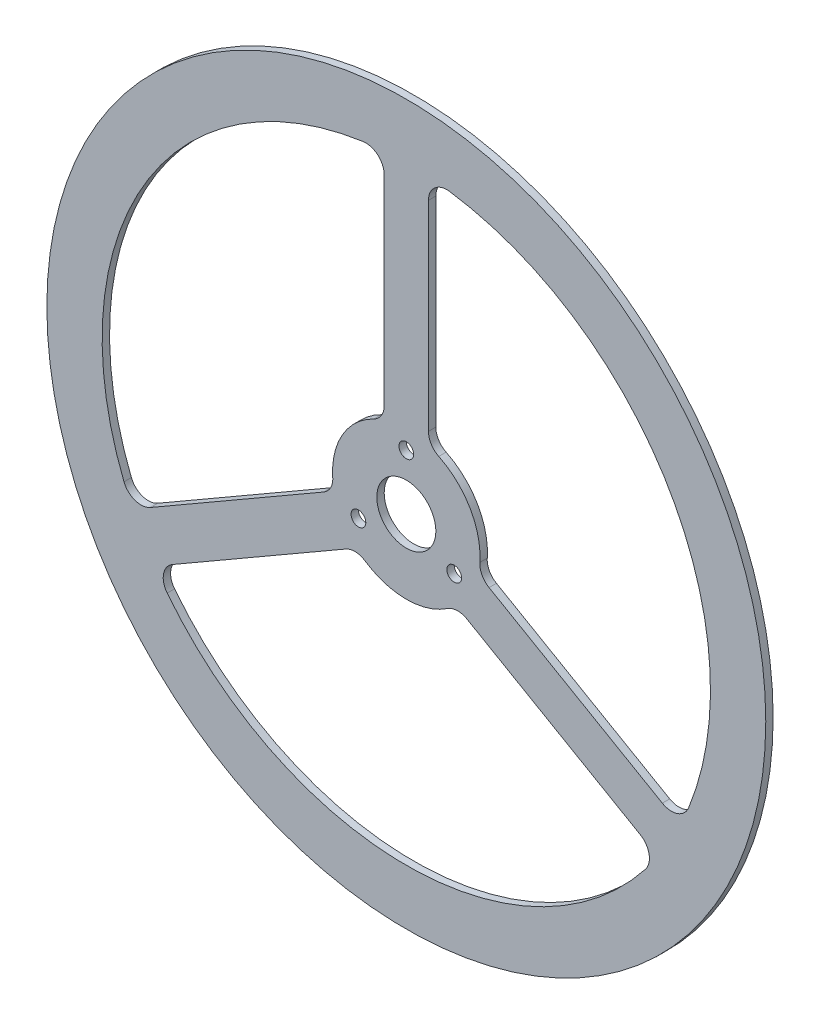
ISO-10303-21;
HEADER;
FILE_DESCRIPTION(('STEP AP214'),'2;1');
FILE_NAME('part.step','',(''),(''),'','','');
FILE_SCHEMA(('AUTOMOTIVE_DESIGN { 1 0 10303 214 1 1 1 1 }'));
ENDSEC;
DATA;
#1=APPLICATION_CONTEXT('core data for automotive mechanical design processes');
#2=APPLICATION_PROTOCOL_DEFINITION('international standard','automotive_design',2000,#1);
#3=PRODUCT_CONTEXT('',#1,'mechanical');
#4=PRODUCT('Part','Part','',(#3));
#5=PRODUCT_RELATED_PRODUCT_CATEGORY('part','',(#4));
#6=PRODUCT_DEFINITION_FORMATION('','',#4);
#7=PRODUCT_DEFINITION_CONTEXT('part definition',#1,'design');
#8=PRODUCT_DEFINITION('design','',#6,#7);
#9=PRODUCT_DEFINITION_SHAPE('','',#8);
#10=(LENGTH_UNIT() NAMED_UNIT(*) SI_UNIT(.MILLI.,.METRE.));
#11=(NAMED_UNIT(*) PLANE_ANGLE_UNIT() SI_UNIT($,.RADIAN.));
#12=(NAMED_UNIT(*) SI_UNIT($,.STERADIAN.) SOLID_ANGLE_UNIT());
#13=UNCERTAINTY_MEASURE_WITH_UNIT(LENGTH_MEASURE(1.E-05),#10,'distance_accuracy_value','');
#14=(GEOMETRIC_REPRESENTATION_CONTEXT(3) GLOBAL_UNCERTAINTY_ASSIGNED_CONTEXT((#13)) GLOBAL_UNIT_ASSIGNED_CONTEXT((#10,
#11,#12)) REPRESENTATION_CONTEXT('',''));
#15=CARTESIAN_POINT('',(0.,0.,0.));
#16=DIRECTION('',(0.,0.,1.));
#17=DIRECTION('',(1.,0.,0.));
#18=AXIS2_PLACEMENT_3D('',#15,#16,#17);
#19=CARTESIAN_POINT('',(0.,0.,0.));
#20=DIRECTION('',(0.,0.,1.));
#21=DIRECTION('',(1.,0.,0.));
#22=AXIS2_PLACEMENT_3D('',#19,#20,#21);
#23=PLANE('',#22);
#24=CARTESIAN_POINT('',(0.,0.,0.));
#25=DIRECTION('',(0.,0.,-1.));
#26=DIRECTION('',(-1.,0.,0.));
#27=AXIS2_PLACEMENT_3D('',#24,#25,#26);
#28=CIRCLE('',#27,97.5);
#29=CARTESIAN_POINT('',(-97.5,0.,0.));
#30=VERTEX_POINT('',#29);
#31=EDGE_CURVE('E286',#30,#30,#28,.F.);
#32=ORIENTED_EDGE('',*,*,#31,.F.);
#33=EDGE_LOOP('',(#32));
#34=FACE_BOUND('',#33,.T.);
#35=CARTESIAN_POINT('',(11.,22.4499443206437,0.));
#36=DIRECTION('',(0.,0.,-1.));
#37=DIRECTION('',(-1.,0.,0.));
#38=AXIS2_PLACEMENT_3D('',#35,#36,#37);
#39=CIRCLE('',#38,5.);
#40=CARTESIAN_POINT('',(5.99999999999999,22.4499443206437,0.));
#41=VERTEX_POINT('',#40);
#42=CARTESIAN_POINT('',(8.79999999999999,17.9599554565149,0.));
#43=VERTEX_POINT('',#42);
#44=EDGE_CURVE('E312',#41,#43,#39,.F.);
#45=ORIENTED_EDGE('',*,*,#44,.T.);
#46=CARTESIAN_POINT('',(0.,0.,0.));
#47=DIRECTION('',(0.,0.,-1.));
#48=DIRECTION('',(-1.,0.,0.));
#49=AXIS2_PLACEMENT_3D('',#46,#47,#48);
#50=CIRCLE('',#49,20.);
#51=CARTESIAN_POINT('',(19.9537776761789,-1.35895417495439,0.));
#52=VERTEX_POINT('',#51);
#53=EDGE_CURVE('E291',#52,#43,#50,.F.);
#54=ORIENTED_EDGE('',*,*,#53,.F.);
#55=CARTESIAN_POINT('',(24.9422220952236,-1.69869271869299,0.));
#56=DIRECTION('',(0.,0.,-1.));
#57=DIRECTION('',(-1.,0.,0.));
#58=AXIS2_PLACEMENT_3D('',#55,#56,#57);
#59=CIRCLE('',#58,5.);
#60=CARTESIAN_POINT('',(22.4422220952236,-6.02881973761519,0.));
#61=VERTEX_POINT('',#60);
#62=EDGE_CURVE('E296',#52,#61,#59,.F.);
#63=ORIENTED_EDGE('',*,*,#62,.T.);
#64=DIRECTION('',(0.866025403784439,-0.5,0.));
#65=VECTOR('',#64,1.);
#66=CARTESIAN_POINT('',(22.4422220952236,-6.02881973761519,0.));
#67=LINE('',#66,#65);
#68=CARTESIAN_POINT('',(69.4374706020631,-33.1615391136723,0.));
#69=VERTEX_POINT('',#68);
#70=EDGE_CURVE('E190',#61,#69,#67,.T.);
#71=ORIENTED_EDGE('',*,*,#70,.T.);
#72=CARTESIAN_POINT('',(71.9374706020631,-28.8314120947501,0.));
#73=DIRECTION('',(0.,0.,-1.));
#74=DIRECTION('',(-1.,0.,0.));
#75=AXIS2_PLACEMENT_3D('',#72,#73,#74);
#76=CIRCLE('',#75,5.00000000000002);
#77=CARTESIAN_POINT('',(76.5785977376801,-30.6915031976373,0.));
#78=VERTEX_POINT('',#77);
#79=EDGE_CURVE('E185',#69,#78,#76,.F.);
#80=ORIENTED_EDGE('',*,*,#79,.T.);
#81=CARTESIAN_POINT('',(0.,0.,0.));
#82=DIRECTION('',(0.,0.,-1.));
#83=DIRECTION('',(-1.,0.,0.));
#84=AXIS2_PLACEMENT_3D('',#81,#82,#83);
#85=CIRCLE('',#84,82.5);
#86=CARTESIAN_POINT('',(11.7096774193548,81.6647626258391,0.));
#87=VERTEX_POINT('',#86);
#88=EDGE_CURVE('E302',#78,#87,#85,.F.);
#89=ORIENTED_EDGE('',*,*,#88,.T.);
#90=CARTESIAN_POINT('',(11.,76.715383072758,0.));
#91=DIRECTION('',(0.,0.,-1.));
#92=DIRECTION('',(-1.,0.,0.));
#93=AXIS2_PLACEMENT_3D('',#90,#91,#92);
#94=CIRCLE('',#93,5.);
#95=CARTESIAN_POINT('',(5.99999999999999,76.715383072758,0.));
#96=VERTEX_POINT('',#95);
#97=EDGE_CURVE('E307',#87,#96,#94,.F.);
#98=ORIENTED_EDGE('',*,*,#97,.T.);
#99=DIRECTION('',(0.,1.,0.));
#100=VECTOR('',#99,1.);
#101=CARTESIAN_POINT('',(5.99999999999999,22.4499443206437,0.));
#102=LINE('',#101,#100);
#103=EDGE_CURVE('E781',#96,#41,#102,.F.);
#104=ORIENTED_EDGE('',*,*,#103,.T.);
#105=EDGE_LOOP('',(#45,#54,#63,#71,#80,#89,#98,#104));
#106=FACE_BOUND('',#105,.T.);
#107=CARTESIAN_POINT('',(13.9422220952236,-20.7512516019506,0.));
#108=DIRECTION('',(0.,0.,-1.));
#109=DIRECTION('',(-1.,0.,0.));
#110=AXIS2_PLACEMENT_3D('',#107,#108,#109);
#111=CIRCLE('',#110,5.);
#112=CARTESIAN_POINT('',(16.4422220952236,-16.4211245830284,0.));
#113=VERTEX_POINT('',#112);
#114=CARTESIAN_POINT('',(11.1537776761789,-16.6010012815605,0.));
#115=VERTEX_POINT('',#114);
#116=EDGE_CURVE('E342',#113,#115,#111,.F.);
#117=ORIENTED_EDGE('',*,*,#116,.T.);
#118=CARTESIAN_POINT('',(0.,0.,0.));
#119=DIRECTION('',(0.,0.,-1.));
#120=DIRECTION('',(-1.,0.,0.));
#121=AXIS2_PLACEMENT_3D('',#118,#119,#120);
#122=CIRCLE('',#121,20.);
#123=CARTESIAN_POINT('',(-11.1537776761789,-16.6010012815605,0.));
#124=VERTEX_POINT('',#123);
#125=EDGE_CURVE('E317',#124,#115,#122,.F.);
#126=ORIENTED_EDGE('',*,*,#125,.F.);
#127=CARTESIAN_POINT('',(-13.9422220952236,-20.7512516019506,0.));
#128=DIRECTION('',(0.,0.,-1.));
#129=DIRECTION('',(-1.,0.,0.));
#130=AXIS2_PLACEMENT_3D('',#127,#128,#129);
#131=CIRCLE('',#130,5.);
#132=CARTESIAN_POINT('',(-16.4422220952236,-16.4211245830285,0.));
#133=VERTEX_POINT('',#132);
#134=EDGE_CURVE('E322',#124,#133,#131,.F.);
#135=ORIENTED_EDGE('',*,*,#134,.T.);
#136=DIRECTION('',(-0.866025403784439,-0.5,0.));
#137=VECTOR('',#136,1.);
#138=CARTESIAN_POINT('',(-16.4422220952236,-16.4211245830285,0.));
#139=LINE('',#138,#137);
#140=CARTESIAN_POINT('',(-63.4374706020631,-43.5538439590856,0.));
#141=VERTEX_POINT('',#140);
#142=EDGE_CURVE('E783',#133,#141,#139,.T.);
#143=ORIENTED_EDGE('',*,*,#142,.T.);
#144=CARTESIAN_POINT('',(-60.9374706020631,-47.8839709780078,0.));
#145=DIRECTION('',(0.,0.,-1.));
#146=DIRECTION('',(-1.,0.,0.));
#147=AXIS2_PLACEMENT_3D('',#144,#145,#146);
#148=CIRCLE('',#147,5.);
#149=CARTESIAN_POINT('',(-64.8689203183253,-50.9732594282018,0.));
#150=VERTEX_POINT('',#149);
#151=EDGE_CURVE('E327',#141,#150,#148,.F.);
#152=ORIENTED_EDGE('',*,*,#151,.T.);
#153=CARTESIAN_POINT('',(0.,0.,0.));
#154=DIRECTION('',(0.,0.,-1.));
#155=DIRECTION('',(-1.,0.,0.));
#156=AXIS2_PLACEMENT_3D('',#153,#154,#155);
#157=CIRCLE('',#156,82.5);
#158=CARTESIAN_POINT('',(64.8689203183253,-50.9732594282018,0.));
#159=VERTEX_POINT('',#158);
#160=EDGE_CURVE('E332',#150,#159,#157,.F.);
#161=ORIENTED_EDGE('',*,*,#160,.T.);
#162=CARTESIAN_POINT('',(60.9374706020631,-47.8839709780078,0.));
#163=DIRECTION('',(0.,0.,-1.));
#164=DIRECTION('',(-1.,0.,0.));
#165=AXIS2_PLACEMENT_3D('',#162,#163,#164);
#166=CIRCLE('',#165,5.);
#167=CARTESIAN_POINT('',(63.4374706020631,-43.5538439590856,0.));
#168=VERTEX_POINT('',#167);
#169=EDGE_CURVE('E337',#159,#168,#166,.F.);
#170=ORIENTED_EDGE('',*,*,#169,.T.);
#171=DIRECTION('',(-0.866025403784439,0.5,0.));
#172=VECTOR('',#171,1.);
#173=CARTESIAN_POINT('',(16.4422220952236,-16.4211245830284,0.));
#174=LINE('',#173,#172);
#175=EDGE_CURVE('E787',#168,#113,#174,.T.);
#176=ORIENTED_EDGE('',*,*,#175,.T.);
#177=EDGE_LOOP('',(#117,#126,#135,#143,#152,#161,#170,#176));
#178=FACE_BOUND('',#177,.T.);
#179=CARTESIAN_POINT('',(0.,0.,0.));
#180=DIRECTION('',(0.,0.,-1.));
#181=DIRECTION('',(-1.,0.,0.));
#182=AXIS2_PLACEMENT_3D('',#179,#180,#181);
#183=CIRCLE('',#182,8.);
#184=CARTESIAN_POINT('',(-8.,0.,0.));
#185=VERTEX_POINT('',#184);
#186=EDGE_CURVE('E346',#185,#185,#183,.F.);
#187=ORIENTED_EDGE('',*,*,#186,.T.);
#188=EDGE_LOOP('',(#187));
#189=FACE_BOUND('',#188,.T.);
#190=CARTESIAN_POINT('',(-24.9422220952236,-1.698692718693,0.));
#191=DIRECTION('',(0.,0.,-1.));
#192=DIRECTION('',(-1.,0.,0.));
#193=AXIS2_PLACEMENT_3D('',#190,#191,#192);
#194=CIRCLE('',#193,5.);
#195=CARTESIAN_POINT('',(-22.4422220952236,-6.02881973761519,0.));
#196=VERTEX_POINT('',#195);
#197=CARTESIAN_POINT('',(-19.9537776761789,-1.3589541749544,0.));
#198=VERTEX_POINT('',#197);
#199=EDGE_CURVE('E374',#196,#198,#194,.F.);
#200=ORIENTED_EDGE('',*,*,#199,.T.);
#201=CARTESIAN_POINT('',(0.,0.,0.));
#202=DIRECTION('',(0.,0.,-1.));
#203=DIRECTION('',(-1.,0.,0.));
#204=AXIS2_PLACEMENT_3D('',#201,#202,#203);
#205=CIRCLE('',#204,20.);
#206=CARTESIAN_POINT('',(-8.8,17.9599554565149,0.));
#207=VERTEX_POINT('',#206);
#208=EDGE_CURVE('E350',#207,#198,#205,.F.);
#209=ORIENTED_EDGE('',*,*,#208,.F.);
#210=CARTESIAN_POINT('',(-11.,22.4499443206436,0.));
#211=DIRECTION('',(0.,0.,-1.));
#212=DIRECTION('',(-1.,0.,0.));
#213=AXIS2_PLACEMENT_3D('',#210,#211,#212);
#214=CIRCLE('',#213,5.);
#215=CARTESIAN_POINT('',(-5.99999999999999,22.4499443206436,0.));
#216=VERTEX_POINT('',#215);
#217=EDGE_CURVE('E354',#207,#216,#214,.F.);
#218=ORIENTED_EDGE('',*,*,#217,.T.);
#219=DIRECTION('',(0.,1.,0.));
#220=VECTOR('',#219,1.);
#221=CARTESIAN_POINT('',(-5.99999999999999,22.4499443206436,0.));
#222=LINE('',#221,#220);
#223=CARTESIAN_POINT('',(-6.,76.715383072758,0.));
#224=VERTEX_POINT('',#223);
#225=EDGE_CURVE('E790',#216,#224,#222,.T.);
#226=ORIENTED_EDGE('',*,*,#225,.T.);
#227=CARTESIAN_POINT('',(-11.,76.715383072758,0.));
#228=DIRECTION('',(0.,0.,-1.));
#229=DIRECTION('',(-1.,0.,0.));
#230=AXIS2_PLACEMENT_3D('',#227,#228,#229);
#231=CIRCLE('',#230,5.);
#232=CARTESIAN_POINT('',(-11.7096774193548,81.6647626258391,0.));
#233=VERTEX_POINT('',#232);
#234=EDGE_CURVE('E359',#224,#233,#231,.F.);
#235=ORIENTED_EDGE('',*,*,#234,.T.);
#236=CARTESIAN_POINT('',(0.,0.,0.));
#237=DIRECTION('',(0.,0.,-1.));
#238=DIRECTION('',(-1.,0.,0.));
#239=AXIS2_PLACEMENT_3D('',#236,#237,#238);
#240=CIRCLE('',#239,82.5);
#241=CARTESIAN_POINT('',(-76.5785977376801,-30.6915031976373,0.));
#242=VERTEX_POINT('',#241);
#243=EDGE_CURVE('E365',#233,#242,#240,.F.);
#244=ORIENTED_EDGE('',*,*,#243,.T.);
#245=CARTESIAN_POINT('',(-71.9374706020631,-28.8314120947501,0.));
#246=DIRECTION('',(0.,0.,-1.));
#247=DIRECTION('',(-1.,0.,0.));
#248=AXIS2_PLACEMENT_3D('',#245,#246,#247);
#249=CIRCLE('',#248,5.);
#250=CARTESIAN_POINT('',(-69.4374706020631,-33.1615391136723,0.));
#251=VERTEX_POINT('',#250);
#252=EDGE_CURVE('E369',#242,#251,#249,.F.);
#253=ORIENTED_EDGE('',*,*,#252,.T.);
#254=DIRECTION('',(0.866025403784439,0.5,0.));
#255=VECTOR('',#254,1.);
#256=CARTESIAN_POINT('',(-22.4422220952236,-6.02881973761519,0.));
#257=LINE('',#256,#255);
#258=EDGE_CURVE('E769',#251,#196,#257,.T.);
#259=ORIENTED_EDGE('',*,*,#258,.T.);
#260=EDGE_LOOP('',(#200,#209,#218,#226,#235,#244,#253,#259));
#261=FACE_BOUND('',#260,.T.);
#262=CARTESIAN_POINT('',(0.,15.,0.));
#263=DIRECTION('',(0.,0.,-1.));
#264=DIRECTION('',(-1.,0.,0.));
#265=AXIS2_PLACEMENT_3D('',#262,#263,#264);
#266=CIRCLE('',#265,2.);
#267=CARTESIAN_POINT('',(-2.,15.,0.));
#268=VERTEX_POINT('',#267);
#269=EDGE_CURVE('E379',#268,#268,#266,.F.);
#270=ORIENTED_EDGE('',*,*,#269,.T.);
#271=EDGE_LOOP('',(#270));
#272=FACE_BOUND('',#271,.T.);
#273=CARTESIAN_POINT('',(12.9903810567665,-7.50000000000006,0.));
#274=DIRECTION('',(0.,0.,-1.));
#275=DIRECTION('',(-1.,0.,0.));
#276=AXIS2_PLACEMENT_3D('',#273,#274,#275);
#277=CIRCLE('',#276,2.);
#278=CARTESIAN_POINT('',(10.9903810567665,-7.50000000000006,0.));
#279=VERTEX_POINT('',#278);
#280=EDGE_CURVE('E382',#279,#279,#277,.F.);
#281=ORIENTED_EDGE('',*,*,#280,.T.);
#282=EDGE_LOOP('',(#281));
#283=FACE_BOUND('',#282,.T.);
#284=CARTESIAN_POINT('',(-12.9903810567666,-7.49999999999988,0.));
#285=DIRECTION('',(0.,0.,-1.));
#286=DIRECTION('',(-1.,0.,0.));
#287=AXIS2_PLACEMENT_3D('',#284,#285,#286);
#288=CIRCLE('',#287,2.);
#289=CARTESIAN_POINT('',(-14.9903810567667,-7.49999999999988,0.));
#290=VERTEX_POINT('',#289);
#291=EDGE_CURVE('E20',#290,#290,#288,.F.);
#292=ORIENTED_EDGE('',*,*,#291,.T.);
#293=EDGE_LOOP('',(#292));
#294=FACE_BOUND('',#293,.T.);
#295=ADVANCED_FACE('F17',(#34,#106,#178,#189,#261,#272,#283,#294),#23,.F.);
#296=CARTESIAN_POINT('',(-12.9903810567666,-7.49999999999988,2.));
#297=DIRECTION('',(0.,0.,-1.));
#298=DIRECTION('',(-1.,0.,0.));
#299=AXIS2_PLACEMENT_3D('',#296,#297,#298);
#300=CYLINDRICAL_SURFACE('',#299,2.);
#301=ORIENTED_EDGE('',*,*,#291,.F.);
#302=EDGE_LOOP('',(#301));
#303=FACE_BOUND('',#302,.T.);
#304=CARTESIAN_POINT('',(-12.9903810567666,-7.49999999999988,2.));
#305=DIRECTION('',(0.,0.,-1.));
#306=DIRECTION('',(-1.,0.,0.));
#307=AXIS2_PLACEMENT_3D('',#304,#305,#306);
#308=CIRCLE('',#307,2.);
#309=CARTESIAN_POINT('',(-14.9903810567667,-7.49999999999988,2.));
#310=VERTEX_POINT('',#309);
#311=EDGE_CURVE('E282',#310,#310,#308,.T.);
#312=ORIENTED_EDGE('',*,*,#311,.F.);
#313=EDGE_LOOP('',(#312));
#314=FACE_BOUND('',#313,.T.);
#315=ADVANCED_FACE('F395',(#303,#314),#300,.F.);
#316=CARTESIAN_POINT('',(12.9903810567665,-7.50000000000006,2.));
#317=DIRECTION('',(0.,0.,-1.));
#318=DIRECTION('',(-1.,0.,0.));
#319=AXIS2_PLACEMENT_3D('',#316,#317,#318);
#320=CYLINDRICAL_SURFACE('',#319,2.);
#321=ORIENTED_EDGE('',*,*,#280,.F.);
#322=EDGE_LOOP('',(#321));
#323=FACE_BOUND('',#322,.T.);
#324=CARTESIAN_POINT('',(12.9903810567665,-7.50000000000006,2.));
#325=DIRECTION('',(0.,0.,-1.));
#326=DIRECTION('',(-1.,0.,0.));
#327=AXIS2_PLACEMENT_3D('',#324,#325,#326);
#328=CIRCLE('',#327,2.);
#329=CARTESIAN_POINT('',(10.9903810567665,-7.50000000000006,2.));
#330=VERTEX_POINT('',#329);
#331=EDGE_CURVE('E278',#330,#330,#328,.T.);
#332=ORIENTED_EDGE('',*,*,#331,.F.);
#333=EDGE_LOOP('',(#332));
#334=FACE_BOUND('',#333,.T.);
#335=ADVANCED_FACE('F398',(#323,#334),#320,.F.);
#336=CARTESIAN_POINT('',(0.,15.,2.));
#337=DIRECTION('',(0.,0.,-1.));
#338=DIRECTION('',(-1.,0.,0.));
#339=AXIS2_PLACEMENT_3D('',#336,#337,#338);
#340=CYLINDRICAL_SURFACE('',#339,2.);
#341=ORIENTED_EDGE('',*,*,#269,.F.);
#342=EDGE_LOOP('',(#341));
#343=FACE_BOUND('',#342,.T.);
#344=CARTESIAN_POINT('',(0.,15.,2.));
#345=DIRECTION('',(0.,0.,-1.));
#346=DIRECTION('',(-1.,0.,0.));
#347=AXIS2_PLACEMENT_3D('',#344,#345,#346);
#348=CIRCLE('',#347,2.);
#349=CARTESIAN_POINT('',(-2.,15.,2.));
#350=VERTEX_POINT('',#349);
#351=EDGE_CURVE('E274',#350,#350,#348,.T.);
#352=ORIENTED_EDGE('',*,*,#351,.F.);
#353=EDGE_LOOP('',(#352));
#354=FACE_BOUND('',#353,.T.);
#355=ADVANCED_FACE('F507',(#343,#354),#340,.F.);
#356=CARTESIAN_POINT('',(-24.9422220952236,-1.698692718693,2.));
#357=DIRECTION('',(0.,0.,-1.));
#358=DIRECTION('',(-1.,0.,0.));
#359=AXIS2_PLACEMENT_3D('',#356,#357,#358);
#360=CYLINDRICAL_SURFACE('',#359,5.);
#361=DIRECTION('',(0.,0.,1.));
#362=VECTOR('',#361,1.);
#363=CARTESIAN_POINT('',(-22.4422220952236,-6.02881973761519,2.));
#364=LINE('',#363,#362);
#365=CARTESIAN_POINT('',(-22.4422220952236,-6.02881973761519,2.));
#366=VERTEX_POINT('',#365);
#367=EDGE_CURVE('E377',#196,#366,#364,.T.);
#368=ORIENTED_EDGE('',*,*,#367,.T.);
#369=CARTESIAN_POINT('',(-24.9422220952236,-1.698692718693,2.));
#370=DIRECTION('',(0.,0.,-1.));
#371=DIRECTION('',(-1.,0.,0.));
#372=AXIS2_PLACEMENT_3D('',#369,#370,#371);
#373=CIRCLE('',#372,5.);
#374=CARTESIAN_POINT('',(-19.9537776761789,-1.3589541749544,2.));
#375=VERTEX_POINT('',#374);
#376=EDGE_CURVE('E270',#375,#366,#373,.T.);
#377=ORIENTED_EDGE('',*,*,#376,.F.);
#378=DIRECTION('',(0.,0.,-1.));
#379=VECTOR('',#378,1.);
#380=CARTESIAN_POINT('',(-19.9537776761789,-1.3589541749544,2.));
#381=LINE('',#380,#379);
#382=EDGE_CURVE('E378',#198,#375,#381,.F.);
#383=ORIENTED_EDGE('',*,*,#382,.F.);
#384=ORIENTED_EDGE('',*,*,#199,.F.);
#385=EDGE_LOOP('',(#368,#377,#383,#384));
#386=FACE_BOUND('',#385,.T.);
#387=ADVANCED_FACE('F503',(#386),#360,.F.);
#388=CARTESIAN_POINT('',(-22.4422220952236,-6.02881973761519,2.));
#389=DIRECTION('',(0.5,-0.866025403784439,0.));
#390=DIRECTION('',(0.866025403784439,0.5,0.));
#391=AXIS2_PLACEMENT_3D('',#388,#389,#390);
#392=PLANE('',#391);
#393=DIRECTION('',(0.,0.,-1.));
#394=VECTOR('',#393,1.);
#395=CARTESIAN_POINT('',(-69.4374706020631,-33.1615391136724,2.));
#396=LINE('',#395,#394);
#397=CARTESIAN_POINT('',(-69.4374706020631,-33.1615391136724,2.));
#398=VERTEX_POINT('',#397);
#399=EDGE_CURVE('E373',#251,#398,#396,.F.);
#400=ORIENTED_EDGE('',*,*,#399,.T.);
#401=DIRECTION('',(-0.866025403784439,-0.5,0.));
#402=VECTOR('',#401,1.);
#403=CARTESIAN_POINT('',(-22.4422220952236,-6.02881973761519,2.));
#404=LINE('',#403,#402);
#405=EDGE_CURVE('E269',#366,#398,#404,.T.);
#406=ORIENTED_EDGE('',*,*,#405,.F.);
#407=ORIENTED_EDGE('',*,*,#367,.F.);
#408=ORIENTED_EDGE('',*,*,#258,.F.);
#409=EDGE_LOOP('',(#400,#406,#407,#408));
#410=FACE_BOUND('',#409,.T.);
#411=ADVANCED_FACE('F499',(#410),#392,.F.);
#412=CARTESIAN_POINT('',(-71.9374706020631,-28.8314120947501,2.));
#413=DIRECTION('',(0.,0.,-1.));
#414=DIRECTION('',(-1.,0.,0.));
#415=AXIS2_PLACEMENT_3D('',#412,#413,#414);
#416=CYLINDRICAL_SURFACE('',#415,5.);
#417=DIRECTION('',(0.,0.,-1.));
#418=VECTOR('',#417,1.);
#419=CARTESIAN_POINT('',(-76.5785977376801,-30.6915031976373,2.));
#420=LINE('',#419,#418);
#421=CARTESIAN_POINT('',(-76.5785977376801,-30.6915031976373,2.));
#422=VERTEX_POINT('',#421);
#423=EDGE_CURVE('E368',#242,#422,#420,.F.);
#424=ORIENTED_EDGE('',*,*,#423,.T.);
#425=CARTESIAN_POINT('',(-71.9374706020631,-28.8314120947501,2.));
#426=DIRECTION('',(0.,0.,-1.));
#427=DIRECTION('',(-1.,0.,0.));
#428=AXIS2_PLACEMENT_3D('',#425,#426,#427);
#429=CIRCLE('',#428,5.);
#430=EDGE_CURVE('E265',#398,#422,#429,.T.);
#431=ORIENTED_EDGE('',*,*,#430,.F.);
#432=ORIENTED_EDGE('',*,*,#399,.F.);
#433=ORIENTED_EDGE('',*,*,#252,.F.);
#434=EDGE_LOOP('',(#424,#431,#432,#433));
#435=FACE_BOUND('',#434,.T.);
#436=ADVANCED_FACE('F495',(#435),#416,.F.);
#437=CARTESIAN_POINT('',(0.,0.,2.));
#438=DIRECTION('',(0.,0.,-1.));
#439=DIRECTION('',(-1.,0.,0.));
#440=AXIS2_PLACEMENT_3D('',#437,#438,#439);
#441=CYLINDRICAL_SURFACE('',#440,82.5);
#442=DIRECTION('',(0.,0.,-1.));
#443=VECTOR('',#442,1.);
#444=CARTESIAN_POINT('',(-11.7096774193548,81.6647626258391,2.));
#445=LINE('',#444,#443);
#446=CARTESIAN_POINT('',(-11.7096774193548,81.6647626258391,2.));
#447=VERTEX_POINT('',#446);
#448=EDGE_CURVE('E364',#233,#447,#445,.F.);
#449=ORIENTED_EDGE('',*,*,#448,.T.);
#450=CARTESIAN_POINT('',(0.,0.,2.));
#451=DIRECTION('',(0.,0.,-1.));
#452=DIRECTION('',(-1.,0.,0.));
#453=AXIS2_PLACEMENT_3D('',#450,#451,#452);
#454=CIRCLE('',#453,82.5);
#455=EDGE_CURVE('E262',#422,#447,#454,.T.);
#456=ORIENTED_EDGE('',*,*,#455,.F.);
#457=ORIENTED_EDGE('',*,*,#423,.F.);
#458=ORIENTED_EDGE('',*,*,#243,.F.);
#459=EDGE_LOOP('',(#449,#456,#457,#458));
#460=FACE_BOUND('',#459,.T.);
#461=ADVANCED_FACE('F491',(#460),#441,.F.);
#462=CARTESIAN_POINT('',(-11.,76.715383072758,2.));
#463=DIRECTION('',(0.,0.,-1.));
#464=DIRECTION('',(-1.,0.,0.));
#465=AXIS2_PLACEMENT_3D('',#462,#463,#464);
#466=CYLINDRICAL_SURFACE('',#465,5.);
#467=DIRECTION('',(0.,0.,1.));
#468=VECTOR('',#467,1.);
#469=CARTESIAN_POINT('',(-6.,76.715383072758,2.));
#470=LINE('',#469,#468);
#471=CARTESIAN_POINT('',(-6.,76.715383072758,2.));
#472=VERTEX_POINT('',#471);
#473=EDGE_CURVE('E363',#224,#472,#470,.T.);
#474=ORIENTED_EDGE('',*,*,#473,.T.);
#475=CARTESIAN_POINT('',(-11.,76.715383072758,2.));
#476=DIRECTION('',(0.,0.,-1.));
#477=DIRECTION('',(-1.,0.,0.));
#478=AXIS2_PLACEMENT_3D('',#475,#476,#477);
#479=CIRCLE('',#478,5.);
#480=EDGE_CURVE('E259',#447,#472,#479,.T.);
#481=ORIENTED_EDGE('',*,*,#480,.F.);
#482=ORIENTED_EDGE('',*,*,#448,.F.);
#483=ORIENTED_EDGE('',*,*,#234,.F.);
#484=EDGE_LOOP('',(#474,#481,#482,#483));
#485=FACE_BOUND('',#484,.T.);
#486=ADVANCED_FACE('F487',(#485),#466,.F.);
#487=CARTESIAN_POINT('',(-5.99999999999999,22.4499443206436,2.));
#488=DIRECTION('',(1.,0.,0.));
#489=DIRECTION('',(0.,1.,0.));
#490=AXIS2_PLACEMENT_3D('',#487,#488,#489);
#491=PLANE('',#490);
#492=DIRECTION('',(0.,0.,-1.));
#493=VECTOR('',#492,1.);
#494=CARTESIAN_POINT('',(-5.99999999999999,22.4499443206436,2.));
#495=LINE('',#494,#493);
#496=CARTESIAN_POINT('',(-6.,22.4499443206436,2.));
#497=VERTEX_POINT('',#496);
#498=EDGE_CURVE('E358',#216,#497,#495,.F.);
#499=ORIENTED_EDGE('',*,*,#498,.T.);
#500=DIRECTION('',(0.,1.,0.));
#501=VECTOR('',#500,1.);
#502=CARTESIAN_POINT('',(-6.,0.,2.));
#503=LINE('',#502,#501);
#504=EDGE_CURVE('E258',#472,#497,#503,.F.);
#505=ORIENTED_EDGE('',*,*,#504,.F.);
#506=ORIENTED_EDGE('',*,*,#473,.F.);
#507=ORIENTED_EDGE('',*,*,#225,.F.);
#508=EDGE_LOOP('',(#499,#505,#506,#507));
#509=FACE_BOUND('',#508,.T.);
#510=ADVANCED_FACE('F483',(#509),#491,.F.);
#511=CARTESIAN_POINT('',(-11.,22.4499443206436,2.));
#512=DIRECTION('',(0.,0.,-1.));
#513=DIRECTION('',(-1.,0.,0.));
#514=AXIS2_PLACEMENT_3D('',#511,#512,#513);
#515=CYLINDRICAL_SURFACE('',#514,5.);
#516=DIRECTION('',(0.,0.,-1.));
#517=VECTOR('',#516,1.);
#518=CARTESIAN_POINT('',(-8.8,17.9599554565149,2.));
#519=LINE('',#518,#517);
#520=CARTESIAN_POINT('',(-8.8,17.9599554565149,2.));
#521=VERTEX_POINT('',#520);
#522=EDGE_CURVE('E353',#521,#207,#519,.T.);
#523=ORIENTED_EDGE('',*,*,#522,.F.);
#524=CARTESIAN_POINT('',(-11.,22.4499443206436,2.));
#525=DIRECTION('',(0.,0.,-1.));
#526=DIRECTION('',(-1.,0.,0.));
#527=AXIS2_PLACEMENT_3D('',#524,#525,#526);
#528=CIRCLE('',#527,5.);
#529=EDGE_CURVE('E254',#497,#521,#528,.T.);
#530=ORIENTED_EDGE('',*,*,#529,.F.);
#531=ORIENTED_EDGE('',*,*,#498,.F.);
#532=ORIENTED_EDGE('',*,*,#217,.F.);
#533=EDGE_LOOP('',(#523,#530,#531,#532));
#534=FACE_BOUND('',#533,.T.);
#535=ADVANCED_FACE('F479',(#534),#515,.F.);
#536=CARTESIAN_POINT('',(0.,0.,2.));
#537=DIRECTION('',(0.,0.,-1.));
#538=DIRECTION('',(-1.,0.,0.));
#539=AXIS2_PLACEMENT_3D('',#536,#537,#538);
#540=CYLINDRICAL_SURFACE('',#539,20.);
#541=ORIENTED_EDGE('',*,*,#522,.T.);
#542=ORIENTED_EDGE('',*,*,#208,.T.);
#543=ORIENTED_EDGE('',*,*,#382,.T.);
#544=CARTESIAN_POINT('',(0.,0.,2.));
#545=DIRECTION('',(0.,0.,-1.));
#546=DIRECTION('',(-1.,0.,0.));
#547=AXIS2_PLACEMENT_3D('',#544,#545,#546);
#548=CIRCLE('',#547,20.);
#549=EDGE_CURVE('E250',#521,#375,#548,.F.);
#550=ORIENTED_EDGE('',*,*,#549,.F.);
#551=EDGE_LOOP('',(#541,#542,#543,#550));
#552=FACE_BOUND('',#551,.T.);
#553=ADVANCED_FACE('F475',(#552),#540,.T.);
#554=CARTESIAN_POINT('',(0.,0.,2.));
#555=DIRECTION('',(0.,0.,-1.));
#556=DIRECTION('',(-1.,0.,0.));
#557=AXIS2_PLACEMENT_3D('',#554,#555,#556);
#558=CYLINDRICAL_SURFACE('',#557,8.);
#559=ORIENTED_EDGE('',*,*,#186,.F.);
#560=EDGE_LOOP('',(#559));
#561=FACE_BOUND('',#560,.T.);
#562=CARTESIAN_POINT('',(0.,0.,2.));
#563=DIRECTION('',(0.,0.,-1.));
#564=DIRECTION('',(-1.,0.,0.));
#565=AXIS2_PLACEMENT_3D('',#562,#563,#564);
#566=CIRCLE('',#565,8.);
#567=CARTESIAN_POINT('',(-8.,0.,2.));
#568=VERTEX_POINT('',#567);
#569=EDGE_CURVE('E246',#568,#568,#566,.T.);
#570=ORIENTED_EDGE('',*,*,#569,.F.);
#571=EDGE_LOOP('',(#570));
#572=FACE_BOUND('',#571,.T.);
#573=ADVANCED_FACE('F471',(#561,#572),#558,.F.);
#574=CARTESIAN_POINT('',(13.9422220952236,-20.7512516019506,2.));
#575=DIRECTION('',(0.,0.,-1.));
#576=DIRECTION('',(-1.,0.,0.));
#577=AXIS2_PLACEMENT_3D('',#574,#575,#576);
#578=CYLINDRICAL_SURFACE('',#577,5.);
#579=DIRECTION('',(0.,0.,1.));
#580=VECTOR('',#579,1.);
#581=CARTESIAN_POINT('',(16.4422220952236,-16.4211245830284,2.));
#582=LINE('',#581,#580);
#583=CARTESIAN_POINT('',(16.4422220952236,-16.4211245830284,2.));
#584=VERTEX_POINT('',#583);
#585=EDGE_CURVE('E345',#113,#584,#582,.T.);
#586=ORIENTED_EDGE('',*,*,#585,.T.);
#587=CARTESIAN_POINT('',(13.9422220952236,-20.7512516019506,2.));
#588=DIRECTION('',(0.,0.,-1.));
#589=DIRECTION('',(-1.,0.,0.));
#590=AXIS2_PLACEMENT_3D('',#587,#588,#589);
#591=CIRCLE('',#590,5.);
#592=CARTESIAN_POINT('',(11.1537776761789,-16.6010012815605,2.));
#593=VERTEX_POINT('',#592);
#594=EDGE_CURVE('E242',#593,#584,#591,.T.);
#595=ORIENTED_EDGE('',*,*,#594,.F.);
#596=DIRECTION('',(0.,0.,-1.));
#597=VECTOR('',#596,1.);
#598=CARTESIAN_POINT('',(11.1537776761789,-16.6010012815605,2.));
#599=LINE('',#598,#597);
#600=EDGE_CURVE('E321',#115,#593,#599,.F.);
#601=ORIENTED_EDGE('',*,*,#600,.F.);
#602=ORIENTED_EDGE('',*,*,#116,.F.);
#603=EDGE_LOOP('',(#586,#595,#601,#602));
#604=FACE_BOUND('',#603,.T.);
#605=ADVANCED_FACE('F467',(#604),#578,.F.);
#606=CARTESIAN_POINT('',(16.4422220952236,-16.4211245830284,2.));
#607=DIRECTION('',(0.5,0.866025403784439,0.));
#608=DIRECTION('',(-0.866025403784439,0.5,0.));
#609=AXIS2_PLACEMENT_3D('',#606,#607,#608);
#610=PLANE('',#609);
#611=DIRECTION('',(0.,0.,-1.));
#612=VECTOR('',#611,1.);
#613=CARTESIAN_POINT('',(63.4374706020631,-43.5538439590856,2.));
#614=LINE('',#613,#612);
#615=CARTESIAN_POINT('',(63.4374706020631,-43.5538439590856,2.));
#616=VERTEX_POINT('',#615);
#617=EDGE_CURVE('E341',#168,#616,#614,.F.);
#618=ORIENTED_EDGE('',*,*,#617,.T.);
#619=DIRECTION('',(0.866025403784439,-0.5,0.));
#620=VECTOR('',#619,1.);
#621=CARTESIAN_POINT('',(16.4422220952236,-16.4211245830284,2.));
#622=LINE('',#621,#620);
#623=EDGE_CURVE('E241',#584,#616,#622,.T.);
#624=ORIENTED_EDGE('',*,*,#623,.F.);
#625=ORIENTED_EDGE('',*,*,#585,.F.);
#626=ORIENTED_EDGE('',*,*,#175,.F.);
#627=EDGE_LOOP('',(#618,#624,#625,#626));
#628=FACE_BOUND('',#627,.T.);
#629=ADVANCED_FACE('F463',(#628),#610,.F.);
#630=CARTESIAN_POINT('',(60.9374706020631,-47.8839709780078,2.));
#631=DIRECTION('',(0.,0.,-1.));
#632=DIRECTION('',(-1.,0.,0.));
#633=AXIS2_PLACEMENT_3D('',#630,#631,#632);
#634=CYLINDRICAL_SURFACE('',#633,5.);
#635=DIRECTION('',(0.,0.,-1.));
#636=VECTOR('',#635,1.);
#637=CARTESIAN_POINT('',(64.8689203183253,-50.9732594282018,2.));
#638=LINE('',#637,#636);
#639=CARTESIAN_POINT('',(64.8689203183253,-50.9732594282018,2.));
#640=VERTEX_POINT('',#639);
#641=EDGE_CURVE('E336',#159,#640,#638,.F.);
#642=ORIENTED_EDGE('',*,*,#641,.T.);
#643=CARTESIAN_POINT('',(60.9374706020631,-47.8839709780078,2.));
#644=DIRECTION('',(0.,0.,-1.));
#645=DIRECTION('',(-1.,0.,0.));
#646=AXIS2_PLACEMENT_3D('',#643,#644,#645);
#647=CIRCLE('',#646,5.);
#648=EDGE_CURVE('E237',#616,#640,#647,.T.);
#649=ORIENTED_EDGE('',*,*,#648,.F.);
#650=ORIENTED_EDGE('',*,*,#617,.F.);
#651=ORIENTED_EDGE('',*,*,#169,.F.);
#652=EDGE_LOOP('',(#642,#649,#650,#651));
#653=FACE_BOUND('',#652,.T.);
#654=ADVANCED_FACE('F459',(#653),#634,.F.);
#655=CARTESIAN_POINT('',(0.,0.,2.));
#656=DIRECTION('',(0.,0.,-1.));
#657=DIRECTION('',(-1.,0.,0.));
#658=AXIS2_PLACEMENT_3D('',#655,#656,#657);
#659=CYLINDRICAL_SURFACE('',#658,82.5);
#660=DIRECTION('',(0.,0.,-1.));
#661=VECTOR('',#660,1.);
#662=CARTESIAN_POINT('',(-64.8689203183253,-50.9732594282018,2.));
#663=LINE('',#662,#661);
#664=CARTESIAN_POINT('',(-64.8689203183253,-50.9732594282018,2.));
#665=VERTEX_POINT('',#664);
#666=EDGE_CURVE('E331',#150,#665,#663,.F.);
#667=ORIENTED_EDGE('',*,*,#666,.T.);
#668=CARTESIAN_POINT('',(0.,0.,2.));
#669=DIRECTION('',(0.,0.,-1.));
#670=DIRECTION('',(-1.,0.,0.));
#671=AXIS2_PLACEMENT_3D('',#668,#669,#670);
#672=CIRCLE('',#671,82.5);
#673=EDGE_CURVE('E233',#640,#665,#672,.T.);
#674=ORIENTED_EDGE('',*,*,#673,.F.);
#675=ORIENTED_EDGE('',*,*,#641,.F.);
#676=ORIENTED_EDGE('',*,*,#160,.F.);
#677=EDGE_LOOP('',(#667,#674,#675,#676));
#678=FACE_BOUND('',#677,.T.);
#679=ADVANCED_FACE('F455',(#678),#659,.F.);
#680=CARTESIAN_POINT('',(-60.9374706020631,-47.8839709780078,2.));
#681=DIRECTION('',(0.,0.,-1.));
#682=DIRECTION('',(-1.,0.,0.));
#683=AXIS2_PLACEMENT_3D('',#680,#681,#682);
#684=CYLINDRICAL_SURFACE('',#683,5.);
#685=DIRECTION('',(0.,0.,1.));
#686=VECTOR('',#685,1.);
#687=CARTESIAN_POINT('',(-63.4374706020631,-43.5538439590856,2.));
#688=LINE('',#687,#686);
#689=CARTESIAN_POINT('',(-63.4374706020631,-43.5538439590856,2.));
#690=VERTEX_POINT('',#689);
#691=EDGE_CURVE('E330',#141,#690,#688,.T.);
#692=ORIENTED_EDGE('',*,*,#691,.T.);
#693=CARTESIAN_POINT('',(-60.9374706020631,-47.8839709780078,2.));
#694=DIRECTION('',(0.,0.,-1.));
#695=DIRECTION('',(-1.,0.,0.));
#696=AXIS2_PLACEMENT_3D('',#693,#694,#695);
#697=CIRCLE('',#696,5.);
#698=EDGE_CURVE('E230',#665,#690,#697,.T.);
#699=ORIENTED_EDGE('',*,*,#698,.F.);
#700=ORIENTED_EDGE('',*,*,#666,.F.);
#701=ORIENTED_EDGE('',*,*,#151,.F.);
#702=EDGE_LOOP('',(#692,#699,#700,#701));
#703=FACE_BOUND('',#702,.T.);
#704=ADVANCED_FACE('F451',(#703),#684,.F.);
#705=CARTESIAN_POINT('',(-16.4422220952236,-16.4211245830285,2.));
#706=DIRECTION('',(-0.5,0.866025403784439,0.));
#707=DIRECTION('',(-0.866025403784439,-0.5,0.));
#708=AXIS2_PLACEMENT_3D('',#705,#706,#707);
#709=PLANE('',#708);
#710=DIRECTION('',(0.,0.,-1.));
#711=VECTOR('',#710,1.);
#712=CARTESIAN_POINT('',(-16.4422220952236,-16.4211245830285,2.));
#713=LINE('',#712,#711);
#714=CARTESIAN_POINT('',(-16.4422220952236,-16.4211245830285,2.));
#715=VERTEX_POINT('',#714);
#716=EDGE_CURVE('E326',#133,#715,#713,.F.);
#717=ORIENTED_EDGE('',*,*,#716,.T.);
#718=DIRECTION('',(0.866025403784439,0.5,0.));
#719=VECTOR('',#718,1.);
#720=CARTESIAN_POINT('',(-63.4374706020631,-43.5538439590856,2.));
#721=LINE('',#720,#719);
#722=EDGE_CURVE('E229',#690,#715,#721,.T.);
#723=ORIENTED_EDGE('',*,*,#722,.F.);
#724=ORIENTED_EDGE('',*,*,#691,.F.);
#725=ORIENTED_EDGE('',*,*,#142,.F.);
#726=EDGE_LOOP('',(#717,#723,#724,#725));
#727=FACE_BOUND('',#726,.T.);
#728=ADVANCED_FACE('F447',(#727),#709,.F.);
#729=CARTESIAN_POINT('',(-13.9422220952236,-20.7512516019506,2.));
#730=DIRECTION('',(0.,0.,-1.));
#731=DIRECTION('',(-1.,0.,0.));
#732=AXIS2_PLACEMENT_3D('',#729,#730,#731);
#733=CYLINDRICAL_SURFACE('',#732,5.);
#734=DIRECTION('',(0.,0.,-1.));
#735=VECTOR('',#734,1.);
#736=CARTESIAN_POINT('',(-11.1537776761789,-16.6010012815605,2.));
#737=LINE('',#736,#735);
#738=CARTESIAN_POINT('',(-11.1537776761789,-16.6010012815605,2.));
#739=VERTEX_POINT('',#738);
#740=EDGE_CURVE('E316',#739,#124,#737,.T.);
#741=ORIENTED_EDGE('',*,*,#740,.F.);
#742=CARTESIAN_POINT('',(-13.9422220952236,-20.7512516019506,2.));
#743=DIRECTION('',(0.,0.,-1.));
#744=DIRECTION('',(-1.,0.,0.));
#745=AXIS2_PLACEMENT_3D('',#742,#743,#744);
#746=CIRCLE('',#745,5.);
#747=EDGE_CURVE('E225',#715,#739,#746,.T.);
#748=ORIENTED_EDGE('',*,*,#747,.F.);
#749=ORIENTED_EDGE('',*,*,#716,.F.);
#750=ORIENTED_EDGE('',*,*,#134,.F.);
#751=EDGE_LOOP('',(#741,#748,#749,#750));
#752=FACE_BOUND('',#751,.T.);
#753=ADVANCED_FACE('F443',(#752),#733,.F.);
#754=CARTESIAN_POINT('',(0.,0.,2.));
#755=DIRECTION('',(0.,0.,-1.));
#756=DIRECTION('',(-1.,0.,0.));
#757=AXIS2_PLACEMENT_3D('',#754,#755,#756);
#758=CYLINDRICAL_SURFACE('',#757,20.);
#759=CARTESIAN_POINT('',(0.,0.,2.));
#760=DIRECTION('',(0.,0.,-1.));
#761=DIRECTION('',(-1.,0.,0.));
#762=AXIS2_PLACEMENT_3D('',#759,#760,#761);
#763=CIRCLE('',#762,20.);
#764=EDGE_CURVE('E221',#739,#593,#763,.F.);
#765=ORIENTED_EDGE('',*,*,#764,.F.);
#766=ORIENTED_EDGE('',*,*,#740,.T.);
#767=ORIENTED_EDGE('',*,*,#125,.T.);
#768=ORIENTED_EDGE('',*,*,#600,.T.);
#769=EDGE_LOOP('',(#765,#766,#767,#768));
#770=FACE_BOUND('',#769,.T.);
#771=ADVANCED_FACE('F439',(#770),#758,.T.);
#772=CARTESIAN_POINT('',(11.,22.4499443206437,2.));
#773=DIRECTION('',(0.,0.,-1.));
#774=DIRECTION('',(-1.,0.,0.));
#775=AXIS2_PLACEMENT_3D('',#772,#773,#774);
#776=CYLINDRICAL_SURFACE('',#775,5.);
#777=DIRECTION('',(0.,0.,1.));
#778=VECTOR('',#777,1.);
#779=CARTESIAN_POINT('',(5.99999999999999,22.4499443206437,2.));
#780=LINE('',#779,#778);
#781=CARTESIAN_POINT('',(5.99999999999999,22.4499443206437,2.));
#782=VERTEX_POINT('',#781);
#783=EDGE_CURVE('E315',#41,#782,#780,.T.);
#784=ORIENTED_EDGE('',*,*,#783,.T.);
#785=CARTESIAN_POINT('',(11.,22.4499443206437,2.));
#786=DIRECTION('',(0.,0.,-1.));
#787=DIRECTION('',(-1.,0.,0.));
#788=AXIS2_PLACEMENT_3D('',#785,#786,#787);
#789=CIRCLE('',#788,5.);
#790=CARTESIAN_POINT('',(8.79999999999999,17.9599554565149,2.));
#791=VERTEX_POINT('',#790);
#792=EDGE_CURVE('E217',#791,#782,#789,.T.);
#793=ORIENTED_EDGE('',*,*,#792,.F.);
#794=DIRECTION('',(0.,0.,-1.));
#795=VECTOR('',#794,1.);
#796=CARTESIAN_POINT('',(8.79999999999999,17.9599554565149,2.));
#797=LINE('',#796,#795);
#798=EDGE_CURVE('E295',#43,#791,#797,.F.);
#799=ORIENTED_EDGE('',*,*,#798,.F.);
#800=ORIENTED_EDGE('',*,*,#44,.F.);
#801=EDGE_LOOP('',(#784,#793,#799,#800));
#802=FACE_BOUND('',#801,.T.);
#803=ADVANCED_FACE('F435',(#802),#776,.F.);
#804=CARTESIAN_POINT('',(5.99999999999999,22.4499443206437,2.));
#805=DIRECTION('',(-1.,0.,0.));
#806=DIRECTION('',(0.,0.,1.));
#807=AXIS2_PLACEMENT_3D('',#804,#805,#806);
#808=PLANE('',#807);
#809=DIRECTION('',(0.,0.,-1.));
#810=VECTOR('',#809,1.);
#811=CARTESIAN_POINT('',(5.99999999999999,76.715383072758,2.));
#812=LINE('',#811,#810);
#813=CARTESIAN_POINT('',(5.99999999999999,76.715383072758,2.));
#814=VERTEX_POINT('',#813);
#815=EDGE_CURVE('E311',#96,#814,#812,.F.);
#816=ORIENTED_EDGE('',*,*,#815,.T.);
#817=DIRECTION('',(0.,1.,0.));
#818=VECTOR('',#817,1.);
#819=CARTESIAN_POINT('',(5.99999999999999,0.,2.));
#820=LINE('',#819,#818);
#821=EDGE_CURVE('E216',#782,#814,#820,.T.);
#822=ORIENTED_EDGE('',*,*,#821,.F.);
#823=ORIENTED_EDGE('',*,*,#783,.F.);
#824=ORIENTED_EDGE('',*,*,#103,.F.);
#825=EDGE_LOOP('',(#816,#822,#823,#824));
#826=FACE_BOUND('',#825,.T.);
#827=ADVANCED_FACE('F431',(#826),#808,.F.);
#828=CARTESIAN_POINT('',(11.,76.715383072758,2.));
#829=DIRECTION('',(0.,0.,-1.));
#830=DIRECTION('',(-1.,0.,0.));
#831=AXIS2_PLACEMENT_3D('',#828,#829,#830);
#832=CYLINDRICAL_SURFACE('',#831,5.);
#833=DIRECTION('',(0.,0.,-1.));
#834=VECTOR('',#833,1.);
#835=CARTESIAN_POINT('',(11.7096774193548,81.6647626258391,2.));
#836=LINE('',#835,#834);
#837=CARTESIAN_POINT('',(11.7096774193548,81.6647626258391,2.));
#838=VERTEX_POINT('',#837);
#839=EDGE_CURVE('E306',#87,#838,#836,.F.);
#840=ORIENTED_EDGE('',*,*,#839,.T.);
#841=CARTESIAN_POINT('',(11.,76.715383072758,2.));
#842=DIRECTION('',(0.,0.,-1.));
#843=DIRECTION('',(-1.,0.,0.));
#844=AXIS2_PLACEMENT_3D('',#841,#842,#843);
#845=CIRCLE('',#844,5.);
#846=EDGE_CURVE('E209',#814,#838,#845,.T.);
#847=ORIENTED_EDGE('',*,*,#846,.F.);
#848=ORIENTED_EDGE('',*,*,#815,.F.);
#849=ORIENTED_EDGE('',*,*,#97,.F.);
#850=EDGE_LOOP('',(#840,#847,#848,#849));
#851=FACE_BOUND('',#850,.T.);
#852=ADVANCED_FACE('F427',(#851),#832,.F.);
#853=CARTESIAN_POINT('',(0.,0.,2.));
#854=DIRECTION('',(0.,0.,-1.));
#855=DIRECTION('',(-1.,0.,0.));
#856=AXIS2_PLACEMENT_3D('',#853,#854,#855);
#857=CYLINDRICAL_SURFACE('',#856,82.5);
#858=DIRECTION('',(0.,0.,-1.));
#859=VECTOR('',#858,1.);
#860=CARTESIAN_POINT('',(76.5785977376801,-30.6915031976373,2.));
#861=LINE('',#860,#859);
#862=CARTESIAN_POINT('',(76.5785977376801,-30.6915031976373,2.));
#863=VERTEX_POINT('',#862);
#864=EDGE_CURVE('E301',#78,#863,#861,.F.);
#865=ORIENTED_EDGE('',*,*,#864,.T.);
#866=CARTESIAN_POINT('',(0.,0.,2.));
#867=DIRECTION('',(0.,0.,-1.));
#868=DIRECTION('',(-1.,0.,0.));
#869=AXIS2_PLACEMENT_3D('',#866,#867,#868);
#870=CIRCLE('',#869,82.5);
#871=EDGE_CURVE('E202',#838,#863,#870,.T.);
#872=ORIENTED_EDGE('',*,*,#871,.F.);
#873=ORIENTED_EDGE('',*,*,#839,.F.);
#874=ORIENTED_EDGE('',*,*,#88,.F.);
#875=EDGE_LOOP('',(#865,#872,#873,#874));
#876=FACE_BOUND('',#875,.T.);
#877=ADVANCED_FACE('F424',(#876),#857,.F.);
#878=CARTESIAN_POINT('',(71.9374706020631,-28.8314120947501,2.));
#879=DIRECTION('',(0.,0.,-1.));
#880=DIRECTION('',(-1.,0.,0.));
#881=AXIS2_PLACEMENT_3D('',#878,#879,#880);
#882=CYLINDRICAL_SURFACE('',#881,5.00000000000002);
#883=DIRECTION('',(0.,0.,1.));
#884=VECTOR('',#883,1.);
#885=CARTESIAN_POINT('',(69.4374706020631,-33.1615391136723,2.));
#886=LINE('',#885,#884);
#887=CARTESIAN_POINT('',(69.4374706020631,-33.1615391136723,2.));
#888=VERTEX_POINT('',#887);
#889=EDGE_CURVE('E177',#69,#888,#886,.T.);
#890=ORIENTED_EDGE('',*,*,#889,.T.);
#891=CARTESIAN_POINT('',(71.9374706020631,-28.8314120947501,2.));
#892=DIRECTION('',(0.,0.,-1.));
#893=DIRECTION('',(-1.,0.,0.));
#894=AXIS2_PLACEMENT_3D('',#891,#892,#893);
#895=CIRCLE('',#894,5.00000000000002);
#896=EDGE_CURVE('E182',#863,#888,#895,.T.);
#897=ORIENTED_EDGE('',*,*,#896,.F.);
#898=ORIENTED_EDGE('',*,*,#864,.F.);
#899=ORIENTED_EDGE('',*,*,#79,.F.);
#900=EDGE_LOOP('',(#890,#897,#898,#899));
#901=FACE_BOUND('',#900,.T.);
#902=ADVANCED_FACE('F179',(#901),#882,.F.);
#903=CARTESIAN_POINT('',(22.4422220952236,-6.02881973761519,2.));
#904=DIRECTION('',(-0.5,-0.866025403784439,0.));
#905=DIRECTION('',(0.866025403784439,-0.5,0.));
#906=AXIS2_PLACEMENT_3D('',#903,#904,#905);
#907=PLANE('',#906);
#908=DIRECTION('',(0.,0.,-1.));
#909=VECTOR('',#908,1.);
#910=CARTESIAN_POINT('',(22.4422220952236,-6.02881973761519,2.));
#911=LINE('',#910,#909);
#912=CARTESIAN_POINT('',(22.4422220952236,-6.02881973761519,2.));
#913=VERTEX_POINT('',#912);
#914=EDGE_CURVE('E195',#61,#913,#911,.F.);
#915=ORIENTED_EDGE('',*,*,#914,.T.);
#916=DIRECTION('',(-0.866025403784439,0.5,0.));
#917=VECTOR('',#916,1.);
#918=CARTESIAN_POINT('',(69.4374706020631,-33.1615391136723,2.));
#919=LINE('',#918,#917);
#920=EDGE_CURVE('E192',#888,#913,#919,.T.);
#921=ORIENTED_EDGE('',*,*,#920,.F.);
#922=ORIENTED_EDGE('',*,*,#889,.F.);
#923=ORIENTED_EDGE('',*,*,#70,.F.);
#924=EDGE_LOOP('',(#915,#921,#922,#923));
#925=FACE_BOUND('',#924,.T.);
#926=ADVANCED_FACE('F193',(#925),#907,.F.);
#927=CARTESIAN_POINT('',(24.9422220952236,-1.69869271869299,2.));
#928=DIRECTION('',(0.,0.,-1.));
#929=DIRECTION('',(-1.,0.,0.));
#930=AXIS2_PLACEMENT_3D('',#927,#928,#929);
#931=CYLINDRICAL_SURFACE('',#930,5.);
#932=CARTESIAN_POINT('',(24.9422220952236,-1.69869271869299,2.));
#933=DIRECTION('',(0.,0.,-1.));
#934=DIRECTION('',(-1.,0.,0.));
#935=AXIS2_PLACEMENT_3D('',#932,#933,#934);
#936=CIRCLE('',#935,5.);
#937=CARTESIAN_POINT('',(19.9537776761789,-1.35895417495439,2.));
#938=VERTEX_POINT('',#937);
#939=EDGE_CURVE('E35',#913,#938,#936,.T.);
#940=ORIENTED_EDGE('',*,*,#939,.F.);
#941=ORIENTED_EDGE('',*,*,#914,.F.);
#942=ORIENTED_EDGE('',*,*,#62,.F.);
#943=DIRECTION('',(0.,0.,-1.));
#944=VECTOR('',#943,1.);
#945=CARTESIAN_POINT('',(19.9537776761789,-1.35895417495438,2.));
#946=LINE('',#945,#944);
#947=EDGE_CURVE('E290',#938,#52,#946,.T.);
#948=ORIENTED_EDGE('',*,*,#947,.F.);
#949=EDGE_LOOP('',(#940,#941,#942,#948));
#950=FACE_BOUND('',#949,.T.);
#951=ADVANCED_FACE('F415',(#950),#931,.F.);
#952=CARTESIAN_POINT('',(0.,0.,2.));
#953=DIRECTION('',(0.,0.,-1.));
#954=DIRECTION('',(-1.,0.,0.));
#955=AXIS2_PLACEMENT_3D('',#952,#953,#954);
#956=CYLINDRICAL_SURFACE('',#955,20.);
#957=CARTESIAN_POINT('',(0.,0.,2.));
#958=DIRECTION('',(0.,0.,-1.));
#959=DIRECTION('',(-1.,0.,0.));
#960=AXIS2_PLACEMENT_3D('',#957,#958,#959);
#961=CIRCLE('',#960,20.);
#962=EDGE_CURVE('E27',#938,#791,#961,.F.);
#963=ORIENTED_EDGE('',*,*,#962,.F.);
#964=ORIENTED_EDGE('',*,*,#947,.T.);
#965=ORIENTED_EDGE('',*,*,#53,.T.);
#966=ORIENTED_EDGE('',*,*,#798,.T.);
#967=EDGE_LOOP('',(#963,#964,#965,#966));
#968=FACE_BOUND('',#967,.T.);
#969=ADVANCED_FACE('F409',(#968),#956,.T.);
#970=CARTESIAN_POINT('',(0.,0.,2.));
#971=DIRECTION('',(0.,0.,-1.));
#972=DIRECTION('',(-1.,0.,0.));
#973=AXIS2_PLACEMENT_3D('',#970,#971,#972);
#974=CYLINDRICAL_SURFACE('',#973,97.5);
#975=ORIENTED_EDGE('',*,*,#31,.T.);
#976=EDGE_LOOP('',(#975));
#977=FACE_BOUND('',#976,.T.);
#978=CARTESIAN_POINT('',(0.,0.,2.));
#979=DIRECTION('',(0.,0.,-1.));
#980=DIRECTION('',(-1.,0.,0.));
#981=AXIS2_PLACEMENT_3D('',#978,#979,#980);
#982=CIRCLE('',#981,97.5);
#983=CARTESIAN_POINT('',(-97.5,0.,2.));
#984=VERTEX_POINT('',#983);
#985=EDGE_CURVE('E11',#984,#984,#982,.F.);
#986=ORIENTED_EDGE('',*,*,#985,.F.);
#987=EDGE_LOOP('',(#986));
#988=FACE_BOUND('',#987,.T.);
#989=ADVANCED_FACE('F402',(#977,#988),#974,.T.);
#990=CARTESIAN_POINT('',(0.,0.,2.));
#991=DIRECTION('',(0.,0.,1.));
#992=DIRECTION('',(1.,0.,0.));
#993=AXIS2_PLACEMENT_3D('',#990,#991,#992);
#994=PLANE('',#993);
#995=ORIENTED_EDGE('',*,*,#985,.T.);
#996=EDGE_LOOP('',(#995));
#997=FACE_BOUND('',#996,.T.);
#998=ORIENTED_EDGE('',*,*,#939,.T.);
#999=ORIENTED_EDGE('',*,*,#962,.T.);
#1000=ORIENTED_EDGE('',*,*,#792,.T.);
#1001=ORIENTED_EDGE('',*,*,#821,.T.);
#1002=ORIENTED_EDGE('',*,*,#846,.T.);
#1003=ORIENTED_EDGE('',*,*,#871,.T.);
#1004=ORIENTED_EDGE('',*,*,#896,.T.);
#1005=ORIENTED_EDGE('',*,*,#920,.T.);
#1006=EDGE_LOOP('',(#998,#999,#1000,#1001,#1002,#1003,#1004,#1005));
#1007=FACE_BOUND('',#1006,.T.);
#1008=ORIENTED_EDGE('',*,*,#747,.T.);
#1009=ORIENTED_EDGE('',*,*,#764,.T.);
#1010=ORIENTED_EDGE('',*,*,#594,.T.);
#1011=ORIENTED_EDGE('',*,*,#623,.T.);
#1012=ORIENTED_EDGE('',*,*,#648,.T.);
#1013=ORIENTED_EDGE('',*,*,#673,.T.);
#1014=ORIENTED_EDGE('',*,*,#698,.T.);
#1015=ORIENTED_EDGE('',*,*,#722,.T.);
#1016=EDGE_LOOP('',(#1008,#1009,#1010,#1011,#1012,#1013,#1014,#1015));
#1017=FACE_BOUND('',#1016,.T.);
#1018=ORIENTED_EDGE('',*,*,#569,.T.);
#1019=EDGE_LOOP('',(#1018));
#1020=FACE_BOUND('',#1019,.T.);
#1021=ORIENTED_EDGE('',*,*,#549,.T.);
#1022=ORIENTED_EDGE('',*,*,#376,.T.);
#1023=ORIENTED_EDGE('',*,*,#405,.T.);
#1024=ORIENTED_EDGE('',*,*,#430,.T.);
#1025=ORIENTED_EDGE('',*,*,#455,.T.);
#1026=ORIENTED_EDGE('',*,*,#480,.T.);
#1027=ORIENTED_EDGE('',*,*,#504,.T.);
#1028=ORIENTED_EDGE('',*,*,#529,.T.);
#1029=EDGE_LOOP('',(#1021,#1022,#1023,#1024,#1025,#1026,#1027,#1028));
#1030=FACE_BOUND('',#1029,.T.);
#1031=ORIENTED_EDGE('',*,*,#351,.T.);
#1032=EDGE_LOOP('',(#1031));
#1033=FACE_BOUND('',#1032,.T.);
#1034=ORIENTED_EDGE('',*,*,#331,.T.);
#1035=EDGE_LOOP('',(#1034));
#1036=FACE_BOUND('',#1035,.T.);
#1037=ORIENTED_EDGE('',*,*,#311,.T.);
#1038=EDGE_LOOP('',(#1037));
#1039=FACE_BOUND('',#1038,.T.);
#1040=ADVANCED_FACE('F198',(#997,#1007,#1017,#1020,#1030,#1033,#1036,#1039),#994,.T.);
#1041=CLOSED_SHELL('',(#295,#315,#335,#355,#387,#411,#436,#461,#486,#510,#535,#553,#573,#605,
#629,#654,#679,#704,#728,#753,#771,#803,#827,#852,#877,#902,#926,#951,#969,#989,#1040));
#1042=MANIFOLD_SOLID_BREP('B1',#1041);
#1043=ADVANCED_BREP_SHAPE_REPRESENTATION('',(#18,#1042),#14);
#1044=SHAPE_DEFINITION_REPRESENTATION(#9,#1043);
ENDSEC;
END-ISO-10303-21;
